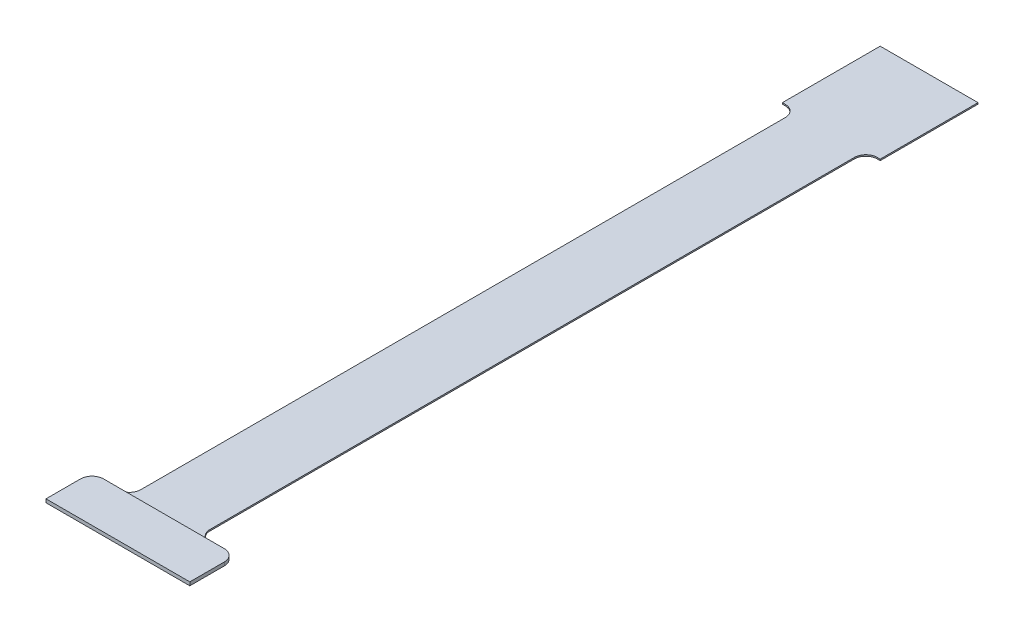
ISO-10303-21;
HEADER;
FILE_DESCRIPTION(('STEP AP214'),'2;1');
FILE_NAME('part.step','',(''),(''),'','','');
FILE_SCHEMA(('AUTOMOTIVE_DESIGN { 1 0 10303 214 1 1 1 1 }'));
ENDSEC;
DATA;
#1=APPLICATION_CONTEXT('core data for automotive mechanical design processes');
#2=APPLICATION_PROTOCOL_DEFINITION('international standard','automotive_design',2000,#1);
#3=PRODUCT_CONTEXT('',#1,'mechanical');
#4=PRODUCT('Part','Part','',(#3));
#5=PRODUCT_RELATED_PRODUCT_CATEGORY('part','',(#4));
#6=PRODUCT_DEFINITION_FORMATION('','',#4);
#7=PRODUCT_DEFINITION_CONTEXT('part definition',#1,'design');
#8=PRODUCT_DEFINITION('design','',#6,#7);
#9=PRODUCT_DEFINITION_SHAPE('','',#8);
#10=(LENGTH_UNIT() NAMED_UNIT(*) SI_UNIT(.MILLI.,.METRE.));
#11=(NAMED_UNIT(*) PLANE_ANGLE_UNIT() SI_UNIT($,.RADIAN.));
#12=(NAMED_UNIT(*) SI_UNIT($,.STERADIAN.) SOLID_ANGLE_UNIT());
#13=UNCERTAINTY_MEASURE_WITH_UNIT(LENGTH_MEASURE(1.E-05),#10,'distance_accuracy_value','');
#14=(GEOMETRIC_REPRESENTATION_CONTEXT(3) GLOBAL_UNCERTAINTY_ASSIGNED_CONTEXT((#13)) GLOBAL_UNIT_ASSIGNED_CONTEXT((#10,
#11,#12)) REPRESENTATION_CONTEXT('',''));
#15=CARTESIAN_POINT('',(0.,0.,0.));
#16=DIRECTION('',(0.,0.,1.));
#17=DIRECTION('',(1.,0.,0.));
#18=AXIS2_PLACEMENT_3D('',#15,#16,#17);
#19=CARTESIAN_POINT('',(-4.25,0.12,0.));
#20=DIRECTION('',(1.,0.,0.));
#21=DIRECTION('',(0.,0.,-1.));
#22=AXIS2_PLACEMENT_3D('',#19,#20,#21);
#23=PLANE('',#22);
#24=DIRECTION('',(0.,0.,1.));
#25=VECTOR('',#24,1.);
#26=CARTESIAN_POINT('',(-4.25,0.,0.));
#27=LINE('',#26,#25);
#28=CARTESIAN_POINT('',(-4.25,0.,0.));
#29=VERTEX_POINT('',#28);
#30=CARTESIAN_POINT('',(-4.25,0.,8.5));
#31=VERTEX_POINT('',#30);
#32=EDGE_CURVE('E193',#29,#31,#27,.T.);
#33=ORIENTED_EDGE('',*,*,#32,.T.);
#34=DIRECTION('',(0.,-1.,0.));
#35=VECTOR('',#34,1.);
#36=CARTESIAN_POINT('',(-4.25,0.12,8.5));
#37=LINE('',#36,#35);
#38=CARTESIAN_POINT('',(-4.25,0.12,8.5));
#39=VERTEX_POINT('',#38);
#40=EDGE_CURVE('E185',#39,#31,#37,.T.);
#41=ORIENTED_EDGE('',*,*,#40,.F.);
#42=DIRECTION('',(0.,0.,1.));
#43=VECTOR('',#42,1.);
#44=CARTESIAN_POINT('',(-4.25,0.12,0.));
#45=LINE('',#44,#43);
#46=CARTESIAN_POINT('',(-4.25,0.12,0.));
#47=VERTEX_POINT('',#46);
#48=EDGE_CURVE('E198',#47,#39,#45,.T.);
#49=ORIENTED_EDGE('',*,*,#48,.F.);
#50=DIRECTION('',(0.,-1.,0.));
#51=VECTOR('',#50,1.);
#52=CARTESIAN_POINT('',(-4.25,0.12,0.));
#53=LINE('',#52,#51);
#54=EDGE_CURVE('E215',#47,#29,#53,.T.);
#55=ORIENTED_EDGE('',*,*,#54,.T.);
#56=EDGE_LOOP('',(#33,#41,#49,#55));
#57=FACE_BOUND('',#56,.T.);
#58=ADVANCED_FACE('F39',(#57),#23,.F.);
#59=CARTESIAN_POINT('',(-4.25,0.12,8.5));
#60=DIRECTION('',(0.,0.,-1.));
#61=DIRECTION('',(-1.,0.,0.));
#62=AXIS2_PLACEMENT_3D('',#59,#60,#61);
#63=PLANE('',#62);
#64=DIRECTION('',(1.,0.,0.));
#65=VECTOR('',#64,1.);
#66=CARTESIAN_POINT('',(-4.25,0.,8.5));
#67=LINE('',#66,#65);
#68=CARTESIAN_POINT('',(-4.,0.,8.5));
#69=VERTEX_POINT('',#68);
#70=EDGE_CURVE('E218',#31,#69,#67,.T.);
#71=ORIENTED_EDGE('',*,*,#70,.T.);
#72=DIRECTION('',(0.,-1.,0.));
#73=VECTOR('',#72,1.);
#74=CARTESIAN_POINT('',(-4.,0.12,8.5));
#75=LINE('',#74,#73);
#76=CARTESIAN_POINT('',(-4.,0.12,8.5));
#77=VERTEX_POINT('',#76);
#78=EDGE_CURVE('E60',#69,#77,#75,.F.);
#79=ORIENTED_EDGE('',*,*,#78,.T.);
#80=DIRECTION('',(1.,0.,0.));
#81=VECTOR('',#80,1.);
#82=CARTESIAN_POINT('',(-4.25,0.12,8.5));
#83=LINE('',#82,#81);
#84=EDGE_CURVE('E201',#39,#77,#83,.T.);
#85=ORIENTED_EDGE('',*,*,#84,.F.);
#86=ORIENTED_EDGE('',*,*,#40,.T.);
#87=EDGE_LOOP('',(#71,#79,#85,#86));
#88=FACE_BOUND('',#87,.T.);
#89=ADVANCED_FACE('F375',(#88),#63,.F.);
#90=CARTESIAN_POINT('',(-3.,0.12,8.5));
#91=DIRECTION('',(1.,0.,0.));
#92=DIRECTION('',(0.,0.,-1.));
#93=AXIS2_PLACEMENT_3D('',#90,#91,#92);
#94=PLANE('',#93);
#95=DIRECTION('',(0.,0.,1.));
#96=VECTOR('',#95,1.);
#97=CARTESIAN_POINT('',(-3.,0.,8.5));
#98=LINE('',#97,#96);
#99=CARTESIAN_POINT('',(-3.,0.,9.5));
#100=VERTEX_POINT('',#99);
#101=CARTESIAN_POINT('',(-3.,0.,65.5));
#102=VERTEX_POINT('',#101);
#103=EDGE_CURVE('E220',#100,#102,#98,.T.);
#104=ORIENTED_EDGE('',*,*,#103,.T.);
#105=DIRECTION('',(0.,-1.,0.));
#106=VECTOR('',#105,1.);
#107=CARTESIAN_POINT('',(-3.,0.12,65.5));
#108=LINE('',#107,#106);
#109=CARTESIAN_POINT('',(-3.,0.12,65.5));
#110=VERTEX_POINT('',#109);
#111=EDGE_CURVE('E285',#102,#110,#108,.F.);
#112=ORIENTED_EDGE('',*,*,#111,.T.);
#113=DIRECTION('',(0.,0.,1.));
#114=VECTOR('',#113,1.);
#115=CARTESIAN_POINT('',(-3.,0.12,8.5));
#116=LINE('',#115,#114);
#117=CARTESIAN_POINT('',(-3.,0.12,9.5));
#118=VERTEX_POINT('',#117);
#119=EDGE_CURVE('E204',#118,#110,#116,.T.);
#120=ORIENTED_EDGE('',*,*,#119,.F.);
#121=DIRECTION('',(0.,-1.,0.));
#122=VECTOR('',#121,1.);
#123=CARTESIAN_POINT('',(-3.,0.,9.5));
#124=LINE('',#123,#122);
#125=EDGE_CURVE('E282',#118,#100,#124,.T.);
#126=ORIENTED_EDGE('',*,*,#125,.T.);
#127=EDGE_LOOP('',(#104,#112,#120,#126));
#128=FACE_BOUND('',#127,.T.);
#129=ADVANCED_FACE('F339',(#128),#94,.F.);
#130=CARTESIAN_POINT('',(-6.25,0.12,66.5));
#131=DIRECTION('',(1.,0.,0.));
#132=DIRECTION('',(0.,0.,-1.));
#133=AXIS2_PLACEMENT_3D('',#130,#131,#132);
#134=PLANE('',#133);
#135=DIRECTION('',(0.,0.,1.));
#136=VECTOR('',#135,1.);
#137=CARTESIAN_POINT('',(-6.25,0.3,66.5));
#138=LINE('',#137,#136);
#139=CARTESIAN_POINT('',(-6.25,0.3,67.5));
#140=VERTEX_POINT('',#139);
#141=CARTESIAN_POINT('',(-6.25,0.3,70.5));
#142=VERTEX_POINT('',#141);
#143=EDGE_CURVE('E164',#140,#142,#138,.T.);
#144=ORIENTED_EDGE('',*,*,#143,.F.);
#145=DIRECTION('',(0.,-1.,0.));
#146=VECTOR('',#145,1.);
#147=CARTESIAN_POINT('',(-6.25,0.12,67.5));
#148=LINE('',#147,#146);
#149=CARTESIAN_POINT('',(-6.25,0.,67.5));
#150=VERTEX_POINT('',#149);
#151=EDGE_CURVE('E255',#140,#150,#148,.T.);
#152=ORIENTED_EDGE('',*,*,#151,.T.);
#153=DIRECTION('',(0.,0.,1.));
#154=VECTOR('',#153,1.);
#155=CARTESIAN_POINT('',(-6.25,0.,66.5));
#156=LINE('',#155,#154);
#157=CARTESIAN_POINT('',(-6.25,0.,70.5));
#158=VERTEX_POINT('',#157);
#159=EDGE_CURVE('E182',#150,#158,#156,.T.);
#160=ORIENTED_EDGE('',*,*,#159,.T.);
#161=DIRECTION('',(0.,-1.,0.));
#162=VECTOR('',#161,1.);
#163=CARTESIAN_POINT('',(-6.25,0.12,70.5));
#164=LINE('',#163,#162);
#165=EDGE_CURVE('E179',#142,#158,#164,.T.);
#166=ORIENTED_EDGE('',*,*,#165,.F.);
#167=EDGE_LOOP('',(#144,#152,#160,#166));
#168=FACE_BOUND('',#167,.T.);
#169=ADVANCED_FACE('F180',(#168),#134,.F.);
#170=CARTESIAN_POINT('',(-6.25,0.12,70.5));
#171=DIRECTION('',(0.,0.,-1.));
#172=DIRECTION('',(-1.,0.,0.));
#173=AXIS2_PLACEMENT_3D('',#170,#171,#172);
#174=PLANE('',#173);
#175=DIRECTION('',(1.,0.,0.));
#176=VECTOR('',#175,1.);
#177=CARTESIAN_POINT('',(-6.25,0.,70.5));
#178=LINE('',#177,#176);
#179=CARTESIAN_POINT('',(6.25,0.,70.5));
#180=VERTEX_POINT('',#179);
#181=EDGE_CURVE('E227',#158,#180,#178,.T.);
#182=ORIENTED_EDGE('',*,*,#181,.T.);
#183=DIRECTION('',(0.,-1.,0.));
#184=VECTOR('',#183,1.);
#185=CARTESIAN_POINT('',(6.25,0.12,70.5));
#186=LINE('',#185,#184);
#187=CARTESIAN_POINT('',(6.25,0.3,70.5));
#188=VERTEX_POINT('',#187);
#189=EDGE_CURVE('E186',#188,#180,#186,.T.);
#190=ORIENTED_EDGE('',*,*,#189,.F.);
#191=DIRECTION('',(1.,0.,0.));
#192=VECTOR('',#191,1.);
#193=CARTESIAN_POINT('',(-6.25,0.3,70.5));
#194=LINE('',#193,#192);
#195=EDGE_CURVE('E170',#142,#188,#194,.T.);
#196=ORIENTED_EDGE('',*,*,#195,.F.);
#197=ORIENTED_EDGE('',*,*,#165,.T.);
#198=EDGE_LOOP('',(#182,#190,#196,#197));
#199=FACE_BOUND('',#198,.T.);
#200=ADVANCED_FACE('F188',(#199),#174,.F.);
#201=CARTESIAN_POINT('',(6.25,0.12,70.5));
#202=DIRECTION('',(-1.,0.,0.));
#203=DIRECTION('',(0.,0.,1.));
#204=AXIS2_PLACEMENT_3D('',#201,#202,#203);
#205=PLANE('',#204);
#206=DIRECTION('',(0.,0.,-1.));
#207=VECTOR('',#206,1.);
#208=CARTESIAN_POINT('',(6.25,0.,70.5));
#209=LINE('',#208,#207);
#210=CARTESIAN_POINT('',(6.25,0.,67.5));
#211=VERTEX_POINT('',#210);
#212=EDGE_CURVE('E229',#180,#211,#209,.T.);
#213=ORIENTED_EDGE('',*,*,#212,.T.);
#214=DIRECTION('',(0.,-1.,0.));
#215=VECTOR('',#214,1.);
#216=CARTESIAN_POINT('',(6.25,0.12,67.5));
#217=LINE('',#216,#215);
#218=CARTESIAN_POINT('',(6.25,0.3,67.5));
#219=VERTEX_POINT('',#218);
#220=EDGE_CURVE('E275',#211,#219,#217,.F.);
#221=ORIENTED_EDGE('',*,*,#220,.T.);
#222=DIRECTION('',(0.,0.,-1.));
#223=VECTOR('',#222,1.);
#224=CARTESIAN_POINT('',(6.25,0.3,66.5));
#225=LINE('',#224,#223);
#226=EDGE_CURVE('E191',#188,#219,#225,.T.);
#227=ORIENTED_EDGE('',*,*,#226,.F.);
#228=ORIENTED_EDGE('',*,*,#189,.T.);
#229=EDGE_LOOP('',(#213,#221,#227,#228));
#230=FACE_BOUND('',#229,.T.);
#231=ADVANCED_FACE('F362',(#230),#205,.F.);
#232=CARTESIAN_POINT('',(6.25,0.12,66.5));
#233=DIRECTION('',(0.,0.,1.));
#234=DIRECTION('',(1.,0.,0.));
#235=AXIS2_PLACEMENT_3D('',#232,#233,#234);
#236=PLANE('',#235);
#237=DIRECTION('',(-1.,0.,0.));
#238=VECTOR('',#237,1.);
#239=CARTESIAN_POINT('',(-3.,0.,66.5));
#240=LINE('',#239,#238);
#241=CARTESIAN_POINT('',(-4.,0.,66.5));
#242=VERTEX_POINT('',#241);
#243=CARTESIAN_POINT('',(-5.25,0.,66.5));
#244=VERTEX_POINT('',#243);
#245=EDGE_CURVE('E223',#242,#244,#240,.T.);
#246=ORIENTED_EDGE('',*,*,#245,.T.);
#247=DIRECTION('',(0.,-1.,0.));
#248=VECTOR('',#247,1.);
#249=CARTESIAN_POINT('',(-5.25,0.12,66.5));
#250=LINE('',#249,#248);
#251=CARTESIAN_POINT('',(-5.25,0.3,66.5));
#252=VERTEX_POINT('',#251);
#253=EDGE_CURVE('E270',#244,#252,#250,.F.);
#254=ORIENTED_EDGE('',*,*,#253,.T.);
#255=DIRECTION('',(-1.,0.,0.));
#256=VECTOR('',#255,1.);
#257=CARTESIAN_POINT('',(-6.25,0.3,66.5));
#258=LINE('',#257,#256);
#259=CARTESIAN_POINT('',(5.25,0.3,66.5));
#260=VERTEX_POINT('',#259);
#261=EDGE_CURVE('E176',#260,#252,#258,.T.);
#262=ORIENTED_EDGE('',*,*,#261,.F.);
#263=DIRECTION('',(0.,-1.,0.));
#264=VECTOR('',#263,1.);
#265=CARTESIAN_POINT('',(5.25,0.12,66.5));
#266=LINE('',#265,#264);
#267=CARTESIAN_POINT('',(5.25,0.,66.5));
#268=VERTEX_POINT('',#267);
#269=EDGE_CURVE('E267',#260,#268,#266,.T.);
#270=ORIENTED_EDGE('',*,*,#269,.T.);
#271=DIRECTION('',(-1.,0.,0.));
#272=VECTOR('',#271,1.);
#273=CARTESIAN_POINT('',(6.25,0.,66.5));
#274=LINE('',#273,#272);
#275=CARTESIAN_POINT('',(4.,0.,66.5));
#276=VERTEX_POINT('',#275);
#277=EDGE_CURVE('E232',#268,#276,#274,.T.);
#278=ORIENTED_EDGE('',*,*,#277,.T.);
#279=DIRECTION('',(0.,-1.,0.));
#280=VECTOR('',#279,1.);
#281=CARTESIAN_POINT('',(4.,0.12,66.5));
#282=LINE('',#281,#280);
#283=CARTESIAN_POINT('',(4.,0.12,66.5));
#284=VERTEX_POINT('',#283);
#285=EDGE_CURVE('E264',#276,#284,#282,.F.);
#286=ORIENTED_EDGE('',*,*,#285,.T.);
#287=DIRECTION('',(-1.,0.,0.));
#288=VECTOR('',#287,1.);
#289=CARTESIAN_POINT('',(-6.25,0.12,66.5));
#290=LINE('',#289,#288);
#291=CARTESIAN_POINT('',(-4.,0.12,66.5));
#292=VERTEX_POINT('',#291);
#293=EDGE_CURVE('E254',#284,#292,#290,.T.);
#294=ORIENTED_EDGE('',*,*,#293,.T.);
#295=DIRECTION('',(0.,-1.,0.));
#296=VECTOR('',#295,1.);
#297=CARTESIAN_POINT('',(-4.,0.,66.5));
#298=LINE('',#297,#296);
#299=EDGE_CURVE('E261',#292,#242,#298,.T.);
#300=ORIENTED_EDGE('',*,*,#299,.T.);
#301=EDGE_LOOP('',(#246,#254,#262,#270,#278,#286,#294,#300));
#302=FACE_BOUND('',#301,.T.);
#303=ADVANCED_FACE('F347',(#302),#236,.F.);
#304=CARTESIAN_POINT('',(3.,0.12,66.5));
#305=DIRECTION('',(-1.,0.,0.));
#306=DIRECTION('',(0.,0.,1.));
#307=AXIS2_PLACEMENT_3D('',#304,#305,#306);
#308=PLANE('',#307);
#309=DIRECTION('',(0.,0.,-1.));
#310=VECTOR('',#309,1.);
#311=CARTESIAN_POINT('',(3.,0.12,66.5));
#312=LINE('',#311,#310);
#313=CARTESIAN_POINT('',(3.,0.12,65.5));
#314=VERTEX_POINT('',#313);
#315=CARTESIAN_POINT('',(3.,0.12,9.50000000000002));
#316=VERTEX_POINT('',#315);
#317=EDGE_CURVE('E207',#314,#316,#312,.T.);
#318=ORIENTED_EDGE('',*,*,#317,.F.);
#319=DIRECTION('',(0.,-1.,0.));
#320=VECTOR('',#319,1.);
#321=CARTESIAN_POINT('',(3.,0.,65.5));
#322=LINE('',#321,#320);
#323=CARTESIAN_POINT('',(3.,0.,65.5));
#324=VERTEX_POINT('',#323);
#325=EDGE_CURVE('E279',#314,#324,#322,.T.);
#326=ORIENTED_EDGE('',*,*,#325,.T.);
#327=DIRECTION('',(0.,0.,-1.));
#328=VECTOR('',#327,1.);
#329=CARTESIAN_POINT('',(3.,0.,66.5));
#330=LINE('',#329,#328);
#331=CARTESIAN_POINT('',(3.,0.,9.50000000000002));
#332=VERTEX_POINT('',#331);
#333=EDGE_CURVE('E235',#324,#332,#330,.T.);
#334=ORIENTED_EDGE('',*,*,#333,.T.);
#335=DIRECTION('',(0.,-1.,0.));
#336=VECTOR('',#335,1.);
#337=CARTESIAN_POINT('',(3.,0.12,9.5));
#338=LINE('',#337,#336);
#339=EDGE_CURVE('E277',#332,#316,#338,.F.);
#340=ORIENTED_EDGE('',*,*,#339,.T.);
#341=EDGE_LOOP('',(#318,#326,#334,#340));
#342=FACE_BOUND('',#341,.T.);
#343=ADVANCED_FACE('F313',(#342),#308,.F.);
#344=CARTESIAN_POINT('',(3.,0.12,8.5));
#345=DIRECTION('',(0.,0.,-1.));
#346=DIRECTION('',(-1.,0.,0.));
#347=AXIS2_PLACEMENT_3D('',#344,#345,#346);
#348=PLANE('',#347);
#349=DIRECTION('',(1.,0.,0.));
#350=VECTOR('',#349,1.);
#351=CARTESIAN_POINT('',(3.,0.12,8.5));
#352=LINE('',#351,#350);
#353=CARTESIAN_POINT('',(4.,0.12,8.5));
#354=VERTEX_POINT('',#353);
#355=CARTESIAN_POINT('',(4.25,0.12,8.5));
#356=VERTEX_POINT('',#355);
#357=EDGE_CURVE('E209',#354,#356,#352,.T.);
#358=ORIENTED_EDGE('',*,*,#357,.F.);
#359=DIRECTION('',(0.,-1.,0.));
#360=VECTOR('',#359,1.);
#361=CARTESIAN_POINT('',(4.,0.,8.5));
#362=LINE('',#361,#360);
#363=CARTESIAN_POINT('',(4.,0.,8.5));
#364=VERTEX_POINT('',#363);
#365=EDGE_CURVE('E288',#354,#364,#362,.T.);
#366=ORIENTED_EDGE('',*,*,#365,.T.);
#367=DIRECTION('',(1.,0.,0.));
#368=VECTOR('',#367,1.);
#369=CARTESIAN_POINT('',(3.,0.,8.5));
#370=LINE('',#369,#368);
#371=CARTESIAN_POINT('',(4.25,0.,8.5));
#372=VERTEX_POINT('',#371);
#373=EDGE_CURVE('E238',#364,#372,#370,.T.);
#374=ORIENTED_EDGE('',*,*,#373,.T.);
#375=DIRECTION('',(0.,-1.,0.));
#376=VECTOR('',#375,1.);
#377=CARTESIAN_POINT('',(4.25,0.12,8.5));
#378=LINE('',#377,#376);
#379=EDGE_CURVE('E248',#356,#372,#378,.T.);
#380=ORIENTED_EDGE('',*,*,#379,.F.);
#381=EDGE_LOOP('',(#358,#366,#374,#380));
#382=FACE_BOUND('',#381,.T.);
#383=ADVANCED_FACE('F316',(#382),#348,.F.);
#384=CARTESIAN_POINT('',(4.25,0.12,8.5));
#385=DIRECTION('',(-1.,0.,0.));
#386=DIRECTION('',(0.,0.,1.));
#387=AXIS2_PLACEMENT_3D('',#384,#385,#386);
#388=PLANE('',#387);
#389=DIRECTION('',(0.,0.,-1.));
#390=VECTOR('',#389,1.);
#391=CARTESIAN_POINT('',(4.25,0.,8.5));
#392=LINE('',#391,#390);
#393=CARTESIAN_POINT('',(4.25,0.,0.));
#394=VERTEX_POINT('',#393);
#395=EDGE_CURVE('E240',#372,#394,#392,.T.);
#396=ORIENTED_EDGE('',*,*,#395,.T.);
#397=DIRECTION('',(0.,-1.,0.));
#398=VECTOR('',#397,1.);
#399=CARTESIAN_POINT('',(4.25,0.12,0.));
#400=LINE('',#399,#398);
#401=CARTESIAN_POINT('',(4.25,0.12,0.));
#402=VERTEX_POINT('',#401);
#403=EDGE_CURVE('E245',#402,#394,#400,.T.);
#404=ORIENTED_EDGE('',*,*,#403,.F.);
#405=DIRECTION('',(0.,0.,-1.));
#406=VECTOR('',#405,1.);
#407=CARTESIAN_POINT('',(4.25,0.12,8.5));
#408=LINE('',#407,#406);
#409=EDGE_CURVE('E211',#356,#402,#408,.T.);
#410=ORIENTED_EDGE('',*,*,#409,.F.);
#411=ORIENTED_EDGE('',*,*,#379,.T.);
#412=EDGE_LOOP('',(#396,#404,#410,#411));
#413=FACE_BOUND('',#412,.T.);
#414=ADVANCED_FACE('F324',(#413),#388,.F.);
#415=CARTESIAN_POINT('',(-4.25,0.12,0.));
#416=DIRECTION('',(0.,0.,1.));
#417=DIRECTION('',(1.,0.,0.));
#418=AXIS2_PLACEMENT_3D('',#415,#416,#417);
#419=PLANE('',#418);
#420=DIRECTION('',(-1.,0.,0.));
#421=VECTOR('',#420,1.);
#422=CARTESIAN_POINT('',(-4.25,0.,0.));
#423=LINE('',#422,#421);
#424=EDGE_CURVE('E202',#394,#29,#423,.T.);
#425=ORIENTED_EDGE('',*,*,#424,.T.);
#426=ORIENTED_EDGE('',*,*,#54,.F.);
#427=DIRECTION('',(-1.,0.,0.));
#428=VECTOR('',#427,1.);
#429=CARTESIAN_POINT('',(-4.25,0.12,0.));
#430=LINE('',#429,#428);
#431=EDGE_CURVE('E213',#402,#47,#430,.T.);
#432=ORIENTED_EDGE('',*,*,#431,.F.);
#433=ORIENTED_EDGE('',*,*,#403,.T.);
#434=EDGE_LOOP('',(#425,#426,#432,#433));
#435=FACE_BOUND('',#434,.T.);
#436=ADVANCED_FACE('F327',(#435),#419,.F.);
#437=CARTESIAN_POINT('',(0.,0.12,0.));
#438=DIRECTION('',(0.,1.,0.));
#439=DIRECTION('',(0.,0.,1.));
#440=AXIS2_PLACEMENT_3D('',#437,#438,#439);
#441=PLANE('',#440);
#442=ORIENTED_EDGE('',*,*,#293,.F.);
#443=CARTESIAN_POINT('',(4.,0.12,65.5));
#444=DIRECTION('',(0.,1.,0.));
#445=DIRECTION('',(0.,0.,1.));
#446=AXIS2_PLACEMENT_3D('',#443,#444,#445);
#447=CIRCLE('',#446,1.);
#448=EDGE_CURVE('E293',#284,#314,#447,.F.);
#449=ORIENTED_EDGE('',*,*,#448,.T.);
#450=ORIENTED_EDGE('',*,*,#317,.T.);
#451=CARTESIAN_POINT('',(4.,0.12,9.5));
#452=DIRECTION('',(0.,1.,0.));
#453=DIRECTION('',(0.,0.,1.));
#454=AXIS2_PLACEMENT_3D('',#451,#452,#453);
#455=CIRCLE('',#454,1.);
#456=EDGE_CURVE('E12',#316,#354,#455,.F.);
#457=ORIENTED_EDGE('',*,*,#456,.T.);
#458=ORIENTED_EDGE('',*,*,#357,.T.);
#459=ORIENTED_EDGE('',*,*,#409,.T.);
#460=ORIENTED_EDGE('',*,*,#431,.T.);
#461=ORIENTED_EDGE('',*,*,#48,.T.);
#462=ORIENTED_EDGE('',*,*,#84,.T.);
#463=CARTESIAN_POINT('',(-4.,0.12,9.5));
#464=DIRECTION('',(0.,1.,0.));
#465=DIRECTION('',(0.,0.,1.));
#466=AXIS2_PLACEMENT_3D('',#463,#464,#465);
#467=CIRCLE('',#466,1.);
#468=EDGE_CURVE('E302',#77,#118,#467,.F.);
#469=ORIENTED_EDGE('',*,*,#468,.T.);
#470=ORIENTED_EDGE('',*,*,#119,.T.);
#471=CARTESIAN_POINT('',(-4.,0.12,65.5));
#472=DIRECTION('',(0.,1.,0.));
#473=DIRECTION('',(0.,0.,1.));
#474=AXIS2_PLACEMENT_3D('',#471,#472,#473);
#475=CIRCLE('',#474,1.);
#476=EDGE_CURVE('E297',#110,#292,#475,.F.);
#477=ORIENTED_EDGE('',*,*,#476,.T.);
#478=EDGE_LOOP('',(#442,#449,#450,#457,#458,#459,#460,#461,#462,#469,#470,#477));
#479=FACE_BOUND('',#478,.T.);
#480=ADVANCED_FACE('F319',(#479),#441,.T.);
#481=CARTESIAN_POINT('',(0.,0.,0.));
#482=DIRECTION('',(0.,1.,0.));
#483=DIRECTION('',(0.,0.,1.));
#484=AXIS2_PLACEMENT_3D('',#481,#482,#483);
#485=PLANE('',#484);
#486=ORIENTED_EDGE('',*,*,#159,.F.);
#487=CARTESIAN_POINT('',(-5.25,0.,67.5));
#488=DIRECTION('',(0.,1.,0.));
#489=DIRECTION('',(0.,0.,1.));
#490=AXIS2_PLACEMENT_3D('',#487,#488,#489);
#491=CIRCLE('',#490,1.);
#492=EDGE_CURVE('E259',#150,#244,#491,.F.);
#493=ORIENTED_EDGE('',*,*,#492,.T.);
#494=ORIENTED_EDGE('',*,*,#245,.F.);
#495=CARTESIAN_POINT('',(-4.,0.,65.5));
#496=DIRECTION('',(0.,1.,0.));
#497=DIRECTION('',(0.,0.,1.));
#498=AXIS2_PLACEMENT_3D('',#495,#496,#497);
#499=CIRCLE('',#498,1.);
#500=EDGE_CURVE('E295',#242,#102,#499,.T.);
#501=ORIENTED_EDGE('',*,*,#500,.T.);
#502=ORIENTED_EDGE('',*,*,#103,.F.);
#503=CARTESIAN_POINT('',(-4.,0.,9.5));
#504=DIRECTION('',(0.,1.,0.));
#505=DIRECTION('',(0.,0.,1.));
#506=AXIS2_PLACEMENT_3D('',#503,#504,#505);
#507=CIRCLE('',#506,1.);
#508=EDGE_CURVE('E300',#100,#69,#507,.T.);
#509=ORIENTED_EDGE('',*,*,#508,.T.);
#510=ORIENTED_EDGE('',*,*,#70,.F.);
#511=ORIENTED_EDGE('',*,*,#32,.F.);
#512=ORIENTED_EDGE('',*,*,#424,.F.);
#513=ORIENTED_EDGE('',*,*,#395,.F.);
#514=ORIENTED_EDGE('',*,*,#373,.F.);
#515=CARTESIAN_POINT('',(4.,0.,9.5));
#516=DIRECTION('',(0.,1.,0.));
#517=DIRECTION('',(0.,0.,1.));
#518=AXIS2_PLACEMENT_3D('',#515,#516,#517);
#519=CIRCLE('',#518,1.);
#520=EDGE_CURVE('E47',#364,#332,#519,.T.);
#521=ORIENTED_EDGE('',*,*,#520,.T.);
#522=ORIENTED_EDGE('',*,*,#333,.F.);
#523=CARTESIAN_POINT('',(4.,0.,65.5));
#524=DIRECTION('',(0.,1.,0.));
#525=DIRECTION('',(0.,0.,1.));
#526=AXIS2_PLACEMENT_3D('',#523,#524,#525);
#527=CIRCLE('',#526,1.);
#528=EDGE_CURVE('E291',#324,#276,#527,.T.);
#529=ORIENTED_EDGE('',*,*,#528,.T.);
#530=ORIENTED_EDGE('',*,*,#277,.F.);
#531=CARTESIAN_POINT('',(5.25,0.,67.5));
#532=DIRECTION('',(0.,1.,0.));
#533=DIRECTION('',(0.,0.,1.));
#534=AXIS2_PLACEMENT_3D('',#531,#532,#533);
#535=CIRCLE('',#534,1.);
#536=EDGE_CURVE('E257',#268,#211,#535,.F.);
#537=ORIENTED_EDGE('',*,*,#536,.T.);
#538=ORIENTED_EDGE('',*,*,#212,.F.);
#539=ORIENTED_EDGE('',*,*,#181,.F.);
#540=EDGE_LOOP('',(#486,#493,#494,#501,#502,#509,#510,#511,#512,#513,#514,#521,#522,#529,#530,
#537,#538,#539));
#541=FACE_BOUND('',#540,.T.);
#542=ADVANCED_FACE('F306',(#541),#485,.F.);
#543=CARTESIAN_POINT('',(0.,0.3,0.));
#544=DIRECTION('',(0.,1.,0.));
#545=DIRECTION('',(0.,0.,1.));
#546=AXIS2_PLACEMENT_3D('',#543,#544,#545);
#547=PLANE('',#546);
#548=ORIENTED_EDGE('',*,*,#261,.T.);
#549=CARTESIAN_POINT('',(-5.25,0.3,67.5));
#550=DIRECTION('',(0.,1.,0.));
#551=DIRECTION('',(0.,0.,1.));
#552=AXIS2_PLACEMENT_3D('',#549,#550,#551);
#553=CIRCLE('',#552,1.);
#554=EDGE_CURVE('E172',#252,#140,#553,.T.);
#555=ORIENTED_EDGE('',*,*,#554,.T.);
#556=ORIENTED_EDGE('',*,*,#143,.T.);
#557=ORIENTED_EDGE('',*,*,#195,.T.);
#558=ORIENTED_EDGE('',*,*,#226,.T.);
#559=CARTESIAN_POINT('',(5.25,0.3,67.5));
#560=DIRECTION('',(0.,1.,0.));
#561=DIRECTION('',(0.,0.,1.));
#562=AXIS2_PLACEMENT_3D('',#559,#560,#561);
#563=CIRCLE('',#562,1.);
#564=EDGE_CURVE('E272',#219,#260,#563,.T.);
#565=ORIENTED_EDGE('',*,*,#564,.T.);
#566=EDGE_LOOP('',(#548,#555,#556,#557,#558,#565));
#567=FACE_BOUND('',#566,.T.);
#568=ADVANCED_FACE('F167',(#567),#547,.T.);
#569=CARTESIAN_POINT('',(-5.25,0.12,67.5));
#570=DIRECTION('',(0.,-1.,0.));
#571=DIRECTION('',(0.,0.,-1.));
#572=AXIS2_PLACEMENT_3D('',#569,#570,#571);
#573=CYLINDRICAL_SURFACE('',#572,1.);
#574=ORIENTED_EDGE('',*,*,#554,.F.);
#575=ORIENTED_EDGE('',*,*,#253,.F.);
#576=ORIENTED_EDGE('',*,*,#492,.F.);
#577=ORIENTED_EDGE('',*,*,#151,.F.);
#578=EDGE_LOOP('',(#574,#575,#576,#577));
#579=FACE_BOUND('',#578,.T.);
#580=ADVANCED_FACE('F364',(#579),#573,.T.);
#581=CARTESIAN_POINT('',(5.25,0.12,67.5));
#582=DIRECTION('',(0.,-1.,0.));
#583=DIRECTION('',(0.,0.,-1.));
#584=AXIS2_PLACEMENT_3D('',#581,#582,#583);
#585=CYLINDRICAL_SURFACE('',#584,1.);
#586=ORIENTED_EDGE('',*,*,#564,.F.);
#587=ORIENTED_EDGE('',*,*,#220,.F.);
#588=ORIENTED_EDGE('',*,*,#536,.F.);
#589=ORIENTED_EDGE('',*,*,#269,.F.);
#590=EDGE_LOOP('',(#586,#587,#588,#589));
#591=FACE_BOUND('',#590,.T.);
#592=ADVANCED_FACE('F358',(#591),#585,.T.);
#593=CARTESIAN_POINT('',(4.,0.12,65.5));
#594=DIRECTION('',(0.,1.,0.));
#595=DIRECTION('',(0.,0.,1.));
#596=AXIS2_PLACEMENT_3D('',#593,#594,#595);
#597=CYLINDRICAL_SURFACE('',#596,1.);
#598=ORIENTED_EDGE('',*,*,#448,.F.);
#599=ORIENTED_EDGE('',*,*,#285,.F.);
#600=ORIENTED_EDGE('',*,*,#528,.F.);
#601=ORIENTED_EDGE('',*,*,#325,.F.);
#602=EDGE_LOOP('',(#598,#599,#600,#601));
#603=FACE_BOUND('',#602,.T.);
#604=ADVANCED_FACE('F352',(#603),#597,.F.);
#605=CARTESIAN_POINT('',(-4.,0.12,65.5));
#606=DIRECTION('',(0.,1.,0.));
#607=DIRECTION('',(0.,0.,1.));
#608=AXIS2_PLACEMENT_3D('',#605,#606,#607);
#609=CYLINDRICAL_SURFACE('',#608,1.);
#610=ORIENTED_EDGE('',*,*,#476,.F.);
#611=ORIENTED_EDGE('',*,*,#111,.F.);
#612=ORIENTED_EDGE('',*,*,#500,.F.);
#613=ORIENTED_EDGE('',*,*,#299,.F.);
#614=EDGE_LOOP('',(#610,#611,#612,#613));
#615=FACE_BOUND('',#614,.T.);
#616=ADVANCED_FACE('F345',(#615),#609,.F.);
#617=CARTESIAN_POINT('',(-4.,0.12,9.5));
#618=DIRECTION('',(0.,1.,0.));
#619=DIRECTION('',(0.,0.,1.));
#620=AXIS2_PLACEMENT_3D('',#617,#618,#619);
#621=CYLINDRICAL_SURFACE('',#620,1.);
#622=ORIENTED_EDGE('',*,*,#468,.F.);
#623=ORIENTED_EDGE('',*,*,#78,.F.);
#624=ORIENTED_EDGE('',*,*,#508,.F.);
#625=ORIENTED_EDGE('',*,*,#125,.F.);
#626=EDGE_LOOP('',(#622,#623,#624,#625));
#627=FACE_BOUND('',#626,.T.);
#628=ADVANCED_FACE('F336',(#627),#621,.F.);
#629=CARTESIAN_POINT('',(4.,0.12,9.5));
#630=DIRECTION('',(0.,1.,0.));
#631=DIRECTION('',(0.,0.,1.));
#632=AXIS2_PLACEMENT_3D('',#629,#630,#631);
#633=CYLINDRICAL_SURFACE('',#632,1.);
#634=ORIENTED_EDGE('',*,*,#456,.F.);
#635=ORIENTED_EDGE('',*,*,#339,.F.);
#636=ORIENTED_EDGE('',*,*,#520,.F.);
#637=ORIENTED_EDGE('',*,*,#365,.F.);
#638=EDGE_LOOP('',(#634,#635,#636,#637));
#639=FACE_BOUND('',#638,.T.);
#640=ADVANCED_FACE('F41',(#639),#633,.F.);
#641=CLOSED_SHELL('',(#58,#89,#129,#169,#200,#231,#303,#343,#383,#414,#436,#480,#542,#568,#580,
#592,#604,#616,#628,#640));
#642=MANIFOLD_SOLID_BREP('B2',#641);
#643=ADVANCED_BREP_SHAPE_REPRESENTATION('',(#18,#642),#14);
#644=SHAPE_DEFINITION_REPRESENTATION(#9,#643);
ENDSEC;
END-ISO-10303-21;
